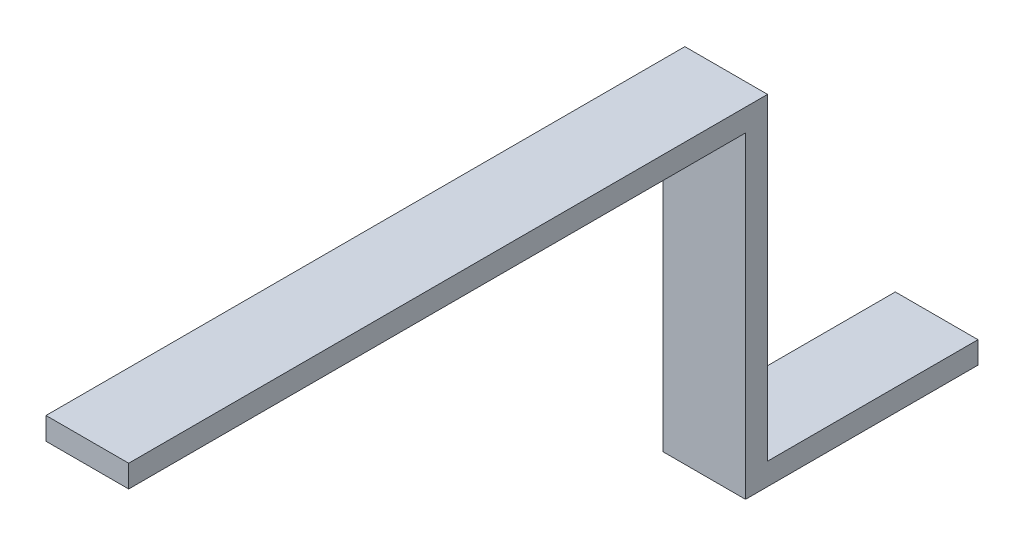
ISO-10303-21;
HEADER;
FILE_DESCRIPTION(('STEP AP214'),'2;1');
FILE_NAME('part.step','',(''),(''),'','','');
FILE_SCHEMA(('AUTOMOTIVE_DESIGN { 1 0 10303 214 1 1 1 1 }'));
ENDSEC;
DATA;
#1=APPLICATION_CONTEXT('core data for automotive mechanical design processes');
#2=APPLICATION_PROTOCOL_DEFINITION('international standard','automotive_design',2000,#1);
#3=PRODUCT_CONTEXT('',#1,'mechanical');
#4=PRODUCT('Part','Part','',(#3));
#5=PRODUCT_RELATED_PRODUCT_CATEGORY('part','',(#4));
#6=PRODUCT_DEFINITION_FORMATION('','',#4);
#7=PRODUCT_DEFINITION_CONTEXT('part definition',#1,'design');
#8=PRODUCT_DEFINITION('design','',#6,#7);
#9=PRODUCT_DEFINITION_SHAPE('','',#8);
#10=(LENGTH_UNIT() NAMED_UNIT(*) SI_UNIT(.MILLI.,.METRE.));
#11=(NAMED_UNIT(*) PLANE_ANGLE_UNIT() SI_UNIT($,.RADIAN.));
#12=(NAMED_UNIT(*) SI_UNIT($,.STERADIAN.) SOLID_ANGLE_UNIT());
#13=UNCERTAINTY_MEASURE_WITH_UNIT(LENGTH_MEASURE(1.E-05),#10,'distance_accuracy_value','');
#14=(GEOMETRIC_REPRESENTATION_CONTEXT(3) GLOBAL_UNCERTAINTY_ASSIGNED_CONTEXT((#13)) GLOBAL_UNIT_ASSIGNED_CONTEXT((#10,
#11,#12)) REPRESENTATION_CONTEXT('',''));
#15=CARTESIAN_POINT('',(0.,0.,0.));
#16=DIRECTION('',(0.,0.,1.));
#17=DIRECTION('',(1.,0.,0.));
#18=AXIS2_PLACEMENT_3D('',#15,#16,#17);
#19=CARTESIAN_POINT('',(0.,0.,0.));
#20=DIRECTION('',(0.,-1.,0.));
#21=DIRECTION('',(0.,0.,-1.));
#22=AXIS2_PLACEMENT_3D('',#19,#20,#21);
#23=PLANE('',#22);
#24=DIRECTION('',(0.,0.,-1.));
#25=VECTOR('',#24,1.);
#26=CARTESIAN_POINT('',(0.374871417880058,1.29236898960272E-13,-1.0539498180151));
#27=LINE('',#26,#25);
#28=CARTESIAN_POINT('',(0.374871417880058,1.15555732910504E-13,2.79608100652695));
#29=VERTEX_POINT('',#28);
#30=CARTESIAN_POINT('',(0.374871417880058,0.,0.));
#31=VERTEX_POINT('',#30);
#32=EDGE_CURVE('E275',#29,#31,#27,.T.);
#33=ORIENTED_EDGE('',*,*,#32,.F.);
#34=DIRECTION('',(1.,0.,0.));
#35=VECTOR('',#34,1.);
#36=CARTESIAN_POINT('',(0.,0.,2.79608100652695));
#37=LINE('',#36,#35);
#38=CARTESIAN_POINT('',(-2.10908683444609E-13,0.,2.79608100652695));
#39=VERTEX_POINT('',#38);
#40=EDGE_CURVE('E144',#39,#29,#37,.T.);
#41=ORIENTED_EDGE('',*,*,#40,.F.);
#42=DIRECTION('',(0.,0.,1.));
#43=VECTOR('',#42,1.);
#44=CARTESIAN_POINT('',(0.,0.,-1.0539498180151));
#45=LINE('',#44,#43);
#46=CARTESIAN_POINT('',(0.,0.,0.));
#47=VERTEX_POINT('',#46);
#48=EDGE_CURVE('E143',#47,#39,#45,.T.);
#49=ORIENTED_EDGE('',*,*,#48,.F.);
#50=DIRECTION('',(1.,0.,0.));
#51=VECTOR('',#50,1.);
#52=CARTESIAN_POINT('',(0.,0.,0.));
#53=LINE('',#52,#51);
#54=EDGE_CURVE('E20',#31,#47,#53,.F.);
#55=ORIENTED_EDGE('',*,*,#54,.F.);
#56=EDGE_LOOP('',(#33,#41,#49,#55));
#57=FACE_BOUND('',#56,.T.);
#58=ADVANCED_FACE('F17',(#57),#23,.T.);
#59=CARTESIAN_POINT('',(0.,-1.43869578838348,0.));
#60=DIRECTION('',(0.,0.,1.));
#61=DIRECTION('',(0.,-1.,0.));
#62=AXIS2_PLACEMENT_3D('',#59,#60,#61);
#63=PLANE('',#62);
#64=DIRECTION('',(0.,1.,0.));
#65=VECTOR('',#64,1.);
#66=CARTESIAN_POINT('',(0.374871417880058,-1.43869578838348,0.));
#67=LINE('',#66,#65);
#68=CARTESIAN_POINT('',(0.374871417880058,-1.43869578838348,0.));
#69=VERTEX_POINT('',#68);
#70=EDGE_CURVE('E138',#31,#69,#67,.F.);
#71=ORIENTED_EDGE('',*,*,#70,.F.);
#72=ORIENTED_EDGE('',*,*,#54,.T.);
#73=DIRECTION('',(0.,1.,0.));
#74=VECTOR('',#73,1.);
#75=CARTESIAN_POINT('',(0.,-1.43869578838348,0.));
#76=LINE('',#75,#74);
#77=CARTESIAN_POINT('',(0.,-1.43869578838348,0.));
#78=VERTEX_POINT('',#77);
#79=EDGE_CURVE('E135',#78,#47,#76,.T.);
#80=ORIENTED_EDGE('',*,*,#79,.F.);
#81=DIRECTION('',(1.,0.,0.));
#82=VECTOR('',#81,1.);
#83=CARTESIAN_POINT('',(0.374871417880058,-1.43869578838348,0.));
#84=LINE('',#83,#82);
#85=EDGE_CURVE('E121',#69,#78,#84,.F.);
#86=ORIENTED_EDGE('',*,*,#85,.F.);
#87=EDGE_LOOP('',(#71,#72,#80,#86));
#88=FACE_BOUND('',#87,.T.);
#89=ADVANCED_FACE('F134',(#88),#63,.T.);
#90=CARTESIAN_POINT('',(0.374871417880058,-1.43869578838348,-1.0539498180151));
#91=DIRECTION('',(0.,-1.,0.));
#92=DIRECTION('',(0.,0.,-1.));
#93=AXIS2_PLACEMENT_3D('',#90,#91,#92);
#94=PLANE('',#93);
#95=ORIENTED_EDGE('',*,*,#85,.T.);
#96=DIRECTION('',(0.,0.,1.));
#97=VECTOR('',#96,1.);
#98=CARTESIAN_POINT('',(0.,-1.43869578838348,-1.0539498180151));
#99=LINE('',#98,#97);
#100=CARTESIAN_POINT('',(0.,-1.43869578838348,-1.0539498180151));
#101=VERTEX_POINT('',#100);
#102=EDGE_CURVE('E149',#101,#78,#99,.T.);
#103=ORIENTED_EDGE('',*,*,#102,.F.);
#104=DIRECTION('',(-1.,0.,0.));
#105=VECTOR('',#104,1.);
#106=CARTESIAN_POINT('',(0.,-1.43869578838348,-1.0539498180151));
#107=LINE('',#106,#105);
#108=CARTESIAN_POINT('',(0.374871417880058,-1.43869578838348,-1.0539498180151));
#109=VERTEX_POINT('',#108);
#110=EDGE_CURVE('E119',#109,#101,#107,.T.);
#111=ORIENTED_EDGE('',*,*,#110,.F.);
#112=DIRECTION('',(0.,0.,-1.));
#113=VECTOR('',#112,1.);
#114=CARTESIAN_POINT('',(0.374871417880058,-1.43869578838348,-1.0539498180151));
#115=LINE('',#114,#113);
#116=EDGE_CURVE('E293',#69,#109,#115,.T.);
#117=ORIENTED_EDGE('',*,*,#116,.F.);
#118=EDGE_LOOP('',(#95,#103,#111,#117));
#119=FACE_BOUND('',#118,.T.);
#120=ADVANCED_FACE('F162',(#119),#94,.T.);
#121=CARTESIAN_POINT('',(0.,-1.3386957347393,-1.0539498180151));
#122=DIRECTION('',(0.,0.,-1.));
#123=DIRECTION('',(-1.,0.,0.));
#124=AXIS2_PLACEMENT_3D('',#121,#122,#123);
#125=PLANE('',#124);
#126=DIRECTION('',(0.,1.,0.));
#127=VECTOR('',#126,1.);
#128=CARTESIAN_POINT('',(0.374871417880058,-1.43869578838348,-1.0539498180151));
#129=LINE('',#128,#127);
#130=CARTESIAN_POINT('',(0.374871417880058,-1.3386957347393,-1.0539498180151));
#131=VERTEX_POINT('',#130);
#132=EDGE_CURVE('E160',#109,#131,#129,.T.);
#133=ORIENTED_EDGE('',*,*,#132,.F.);
#134=ORIENTED_EDGE('',*,*,#110,.T.);
#135=DIRECTION('',(0.,1.,0.));
#136=VECTOR('',#135,1.);
#137=CARTESIAN_POINT('',(0.,-1.43869578838348,-1.0539498180151));
#138=LINE('',#137,#136);
#139=CARTESIAN_POINT('',(0.,-1.3386957347393,-1.0539498180151));
#140=VERTEX_POINT('',#139);
#141=EDGE_CURVE('E103',#140,#101,#138,.F.);
#142=ORIENTED_EDGE('',*,*,#141,.F.);
#143=DIRECTION('',(1.,0.,0.));
#144=VECTOR('',#143,1.);
#145=CARTESIAN_POINT('',(0.,-1.3386957347393,-1.0539498180151));
#146=LINE('',#145,#144);
#147=EDGE_CURVE('E80',#131,#140,#146,.F.);
#148=ORIENTED_EDGE('',*,*,#147,.F.);
#149=EDGE_LOOP('',(#133,#134,#142,#148));
#150=FACE_BOUND('',#149,.T.);
#151=ADVANCED_FACE('F158',(#150),#125,.T.);
#152=CARTESIAN_POINT('',(0.,-1.3386957347393,-1.0539498180151));
#153=DIRECTION('',(0.,1.,0.));
#154=DIRECTION('',(0.,0.,1.));
#155=AXIS2_PLACEMENT_3D('',#152,#153,#154);
#156=PLANE('',#155);
#157=DIRECTION('',(-1.,0.,0.));
#158=VECTOR('',#157,1.);
#159=CARTESIAN_POINT('',(0.,-1.3386957347393,-0.0999999977648258));
#160=LINE('',#159,#158);
#161=CARTESIAN_POINT('',(0.374871417880058,-1.3386957347393,-0.0999999977648258));
#162=VERTEX_POINT('',#161);
#163=CARTESIAN_POINT('',(0.,-1.3386957347393,-0.0999999977648258));
#164=VERTEX_POINT('',#163);
#165=EDGE_CURVE('E86',#162,#164,#160,.T.);
#166=ORIENTED_EDGE('',*,*,#165,.F.);
#167=DIRECTION('',(0.,0.,-1.));
#168=VECTOR('',#167,1.);
#169=CARTESIAN_POINT('',(0.374871417880058,-1.3386957347393,-1.0539498180151));
#170=LINE('',#169,#168);
#171=EDGE_CURVE('E286',#131,#162,#170,.F.);
#172=ORIENTED_EDGE('',*,*,#171,.F.);
#173=ORIENTED_EDGE('',*,*,#147,.T.);
#174=DIRECTION('',(0.,0.,1.));
#175=VECTOR('',#174,1.);
#176=CARTESIAN_POINT('',(0.,-1.3386957347393,-1.0539498180151));
#177=LINE('',#176,#175);
#178=EDGE_CURVE('E98',#164,#140,#177,.F.);
#179=ORIENTED_EDGE('',*,*,#178,.F.);
#180=EDGE_LOOP('',(#166,#172,#173,#179));
#181=FACE_BOUND('',#180,.T.);
#182=ADVANCED_FACE('F99',(#181),#156,.T.);
#183=CARTESIAN_POINT('',(0.,0.101316599175333,-0.0999999977648258));
#184=DIRECTION('',(0.,0.,-1.));
#185=DIRECTION('',(-1.,0.,0.));
#186=AXIS2_PLACEMENT_3D('',#183,#184,#185);
#187=PLANE('',#186);
#188=DIRECTION('',(0.,1.,0.));
#189=VECTOR('',#188,1.);
#190=CARTESIAN_POINT('',(0.374871417880058,-1.43869578838348,-0.0999999977648258));
#191=LINE('',#190,#189);
#192=CARTESIAN_POINT('',(0.374871417880058,0.101316599175333,-0.0999999977648258));
#193=VERTEX_POINT('',#192);
#194=EDGE_CURVE('E92',#162,#193,#191,.T.);
#195=ORIENTED_EDGE('',*,*,#194,.F.);
#196=ORIENTED_EDGE('',*,*,#165,.T.);
#197=DIRECTION('',(0.,1.,0.));
#198=VECTOR('',#197,1.);
#199=CARTESIAN_POINT('',(0.,-1.43869578838348,-0.0999999977648258));
#200=LINE('',#199,#198);
#201=CARTESIAN_POINT('',(0.,0.101316599175333,-0.0999999977648258));
#202=VERTEX_POINT('',#201);
#203=EDGE_CURVE('E89',#202,#164,#200,.F.);
#204=ORIENTED_EDGE('',*,*,#203,.F.);
#205=DIRECTION('',(-1.,0.,0.));
#206=VECTOR('',#205,1.);
#207=CARTESIAN_POINT('',(0.,0.101316599175333,-0.0999999977648258));
#208=LINE('',#207,#206);
#209=EDGE_CURVE('E95',#202,#193,#208,.F.);
#210=ORIENTED_EDGE('',*,*,#209,.T.);
#211=EDGE_LOOP('',(#195,#196,#204,#210));
#212=FACE_BOUND('',#211,.T.);
#213=ADVANCED_FACE('F87',(#212),#187,.T.);
#214=CARTESIAN_POINT('',(0.,-1.43869578838348,-1.0539498180151));
#215=DIRECTION('',(-1.,0.,0.));
#216=DIRECTION('',(0.,0.,1.));
#217=AXIS2_PLACEMENT_3D('',#214,#215,#216);
#218=PLANE('',#217);
#219=ORIENTED_EDGE('',*,*,#79,.T.);
#220=ORIENTED_EDGE('',*,*,#48,.T.);
#221=DIRECTION('',(0.,1.,0.));
#222=VECTOR('',#221,1.);
#223=CARTESIAN_POINT('',(-1.24806315616707E-13,0.101316599175333,2.79608100652695));
#224=LINE('',#223,#222);
#225=CARTESIAN_POINT('',(-1.63214837667492E-13,0.101316599175333,2.79608100652695));
#226=VERTEX_POINT('',#225);
#227=EDGE_CURVE('E147',#226,#39,#224,.F.);
#228=ORIENTED_EDGE('',*,*,#227,.F.);
#229=DIRECTION('',(0.,0.,1.));
#230=VECTOR('',#229,1.);
#231=CARTESIAN_POINT('',(0.,0.101316599175333,-0.0999999977648258));
#232=LINE('',#231,#230);
#233=EDGE_CURVE('E108',#202,#226,#232,.T.);
#234=ORIENTED_EDGE('',*,*,#233,.F.);
#235=ORIENTED_EDGE('',*,*,#203,.T.);
#236=ORIENTED_EDGE('',*,*,#178,.T.);
#237=ORIENTED_EDGE('',*,*,#141,.T.);
#238=ORIENTED_EDGE('',*,*,#102,.T.);
#239=EDGE_LOOP('',(#219,#220,#228,#234,#235,#236,#237,#238));
#240=FACE_BOUND('',#239,.T.);
#241=ADVANCED_FACE('F106',(#240),#218,.T.);
#242=CARTESIAN_POINT('',(0.,0.101316599175333,2.79608100652695));
#243=DIRECTION('',(0.,0.,1.));
#244=DIRECTION('',(1.,0.,0.));
#245=AXIS2_PLACEMENT_3D('',#242,#243,#244);
#246=PLANE('',#245);
#247=ORIENTED_EDGE('',*,*,#40,.T.);
#248=DIRECTION('',(0.,1.,0.));
#249=VECTOR('',#248,1.);
#250=CARTESIAN_POINT('',(0.374871417880058,-1.43869578838348,2.79608100652695));
#251=LINE('',#250,#249);
#252=CARTESIAN_POINT('',(0.374871417880058,0.101316599175333,2.79608100652695));
#253=VERTEX_POINT('',#252);
#254=EDGE_CURVE('E36',#253,#29,#251,.F.);
#255=ORIENTED_EDGE('',*,*,#254,.F.);
#256=DIRECTION('',(1.,0.,0.));
#257=VECTOR('',#256,1.);
#258=CARTESIAN_POINT('',(0.,0.101316599175333,2.79608100652695));
#259=LINE('',#258,#257);
#260=EDGE_CURVE('E27',#226,#253,#259,.T.);
#261=ORIENTED_EDGE('',*,*,#260,.F.);
#262=ORIENTED_EDGE('',*,*,#227,.T.);
#263=EDGE_LOOP('',(#247,#255,#261,#262));
#264=FACE_BOUND('',#263,.T.);
#265=ADVANCED_FACE('F179',(#264),#246,.T.);
#266=CARTESIAN_POINT('',(0.374871417880058,-1.43869578838348,-1.0539498180151));
#267=DIRECTION('',(1.,0.,0.));
#268=DIRECTION('',(0.,0.,-1.));
#269=AXIS2_PLACEMENT_3D('',#266,#267,#268);
#270=PLANE('',#269);
#271=ORIENTED_EDGE('',*,*,#171,.T.);
#272=ORIENTED_EDGE('',*,*,#194,.T.);
#273=DIRECTION('',(0.,0.,1.));
#274=VECTOR('',#273,1.);
#275=CARTESIAN_POINT('',(0.374871417880058,0.101316599175333,-0.0999999977648258));
#276=LINE('',#275,#274);
#277=EDGE_CURVE('E11',#253,#193,#276,.F.);
#278=ORIENTED_EDGE('',*,*,#277,.F.);
#279=ORIENTED_EDGE('',*,*,#254,.T.);
#280=ORIENTED_EDGE('',*,*,#32,.T.);
#281=ORIENTED_EDGE('',*,*,#70,.T.);
#282=ORIENTED_EDGE('',*,*,#116,.T.);
#283=ORIENTED_EDGE('',*,*,#132,.T.);
#284=EDGE_LOOP('',(#271,#272,#278,#279,#280,#281,#282,#283));
#285=FACE_BOUND('',#284,.T.);
#286=ADVANCED_FACE('F173',(#285),#270,.T.);
#287=CARTESIAN_POINT('',(0.,0.101316599175333,-0.0999999977648258));
#288=DIRECTION('',(0.,1.,0.));
#289=DIRECTION('',(0.,0.,1.));
#290=AXIS2_PLACEMENT_3D('',#287,#288,#289);
#291=PLANE('',#290);
#292=ORIENTED_EDGE('',*,*,#260,.T.);
#293=ORIENTED_EDGE('',*,*,#277,.T.);
#294=ORIENTED_EDGE('',*,*,#209,.F.);
#295=ORIENTED_EDGE('',*,*,#233,.T.);
#296=EDGE_LOOP('',(#292,#293,#294,#295));
#297=FACE_BOUND('',#296,.T.);
#298=ADVANCED_FACE('F171',(#297),#291,.T.);
#299=CLOSED_SHELL('',(#58,#89,#120,#151,#182,#213,#241,#265,#286,#298));
#300=MANIFOLD_SOLID_BREP('B1',#299);
#301=ADVANCED_BREP_SHAPE_REPRESENTATION('',(#18,#300),#14);
#302=SHAPE_DEFINITION_REPRESENTATION(#9,#301);
ENDSEC;
END-ISO-10303-21;
